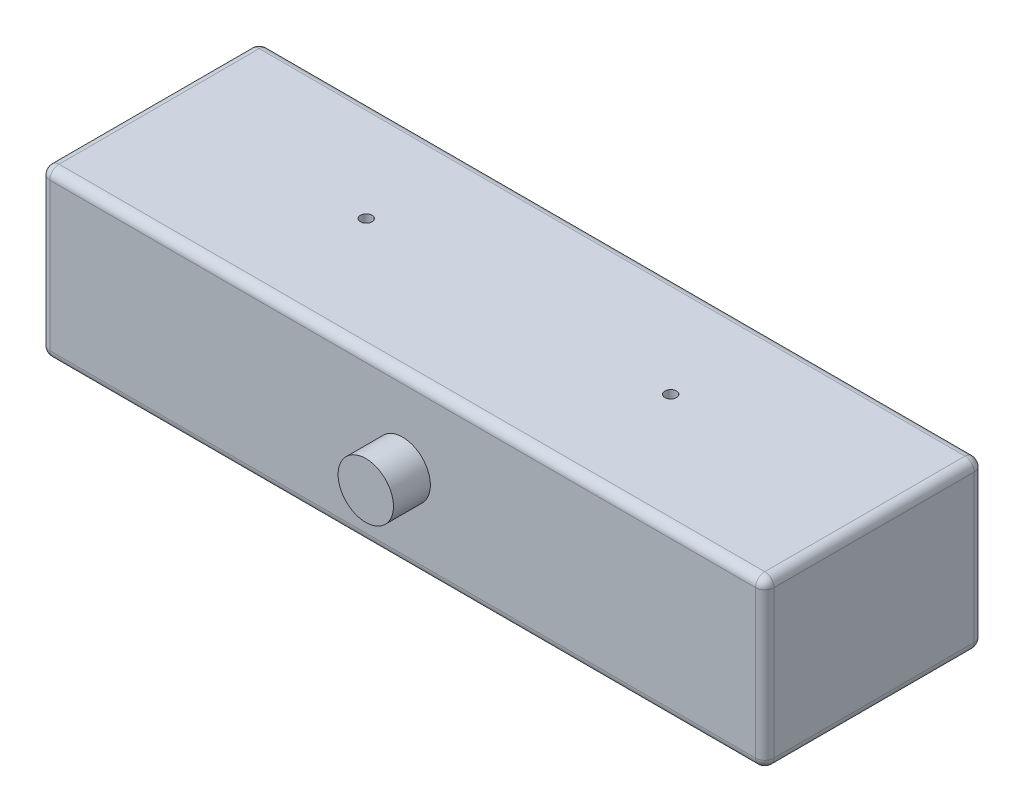
ISO-10303-21;
HEADER;
FILE_DESCRIPTION(('STEP AP214'),'2;1');
FILE_NAME('part.step','',(''),(''),'','','');
FILE_SCHEMA(('AUTOMOTIVE_DESIGN { 1 0 10303 214 1 1 1 1 }'));
ENDSEC;
DATA;
#1=APPLICATION_CONTEXT('core data for automotive mechanical design processes');
#2=APPLICATION_PROTOCOL_DEFINITION('international standard','automotive_design',2000,#1);
#3=PRODUCT_CONTEXT('',#1,'mechanical');
#4=PRODUCT('Part','Part','',(#3));
#5=PRODUCT_RELATED_PRODUCT_CATEGORY('part','',(#4));
#6=PRODUCT_DEFINITION_FORMATION('','',#4);
#7=PRODUCT_DEFINITION_CONTEXT('part definition',#1,'design');
#8=PRODUCT_DEFINITION('design','',#6,#7);
#9=PRODUCT_DEFINITION_SHAPE('','',#8);
#10=(LENGTH_UNIT() NAMED_UNIT(*) SI_UNIT(.MILLI.,.METRE.));
#11=(NAMED_UNIT(*) PLANE_ANGLE_UNIT() SI_UNIT($,.RADIAN.));
#12=(NAMED_UNIT(*) SI_UNIT($,.STERADIAN.) SOLID_ANGLE_UNIT());
#13=UNCERTAINTY_MEASURE_WITH_UNIT(LENGTH_MEASURE(1.E-05),#10,'distance_accuracy_value','');
#14=(GEOMETRIC_REPRESENTATION_CONTEXT(3) GLOBAL_UNCERTAINTY_ASSIGNED_CONTEXT((#13)) GLOBAL_UNIT_ASSIGNED_CONTEXT((#10,
#11,#12)) REPRESENTATION_CONTEXT('',''));
#15=CARTESIAN_POINT('',(0.,0.,0.));
#16=DIRECTION('',(0.,0.,1.));
#17=DIRECTION('',(1.,0.,0.));
#18=AXIS2_PLACEMENT_3D('',#15,#16,#17);
#19=CARTESIAN_POINT('',(78.5,-18.,23.7));
#20=DIRECTION('',(0.,0.,-1.));
#21=DIRECTION('',(-1.,0.,0.));
#22=AXIS2_PLACEMENT_3D('',#19,#20,#21);
#23=PLANE('',#22);
#24=DIRECTION('',(0.,-1.,0.));
#25=VECTOR('',#24,1.);
#26=CARTESIAN_POINT('',(-76.5,-18.,23.7));
#27=LINE('',#26,#25);
#28=CARTESIAN_POINT('',(-76.5,16.,23.7));
#29=VERTEX_POINT('',#28);
#30=CARTESIAN_POINT('',(-76.5,-16.,23.7));
#31=VERTEX_POINT('',#30);
#32=EDGE_CURVE('E158',#29,#31,#27,.T.);
#33=ORIENTED_EDGE('',*,*,#32,.T.);
#34=DIRECTION('',(-1.,0.,0.));
#35=VECTOR('',#34,1.);
#36=CARTESIAN_POINT('',(78.5,-16.,23.7));
#37=LINE('',#36,#35);
#38=CARTESIAN_POINT('',(76.5,-16.,23.7));
#39=VERTEX_POINT('',#38);
#40=EDGE_CURVE('E161',#31,#39,#37,.F.);
#41=ORIENTED_EDGE('',*,*,#40,.T.);
#42=DIRECTION('',(0.,-1.,0.));
#43=VECTOR('',#42,1.);
#44=CARTESIAN_POINT('',(76.5,-18.,23.7));
#45=LINE('',#44,#43);
#46=CARTESIAN_POINT('',(76.5,16.,23.7));
#47=VERTEX_POINT('',#46);
#48=EDGE_CURVE('E155',#39,#47,#45,.F.);
#49=ORIENTED_EDGE('',*,*,#48,.T.);
#50=DIRECTION('',(-1.,0.,0.));
#51=VECTOR('',#50,1.);
#52=CARTESIAN_POINT('',(78.5,16.,23.7));
#53=LINE('',#52,#51);
#54=EDGE_CURVE('E153',#47,#29,#53,.T.);
#55=ORIENTED_EDGE('',*,*,#54,.T.);
#56=EDGE_LOOP('',(#33,#41,#49,#55));
#57=FACE_BOUND('',#56,.T.);
#58=CARTESIAN_POINT('',(0.,0.,23.7));
#59=DIRECTION('',(0.,0.,-1.));
#60=DIRECTION('',(-1.,0.,0.));
#61=AXIS2_PLACEMENT_3D('',#58,#59,#60);
#62=CIRCLE('',#61,6.);
#63=CARTESIAN_POINT('',(-6.,0.,23.7));
#64=VERTEX_POINT('',#63);
#65=EDGE_CURVE('E11',#64,#64,#62,.F.);
#66=ORIENTED_EDGE('',*,*,#65,.F.);
#67=EDGE_LOOP('',(#66));
#68=FACE_BOUND('',#67,.T.);
#69=ADVANCED_FACE('F37',(#57,#68),#23,.F.);
#70=CARTESIAN_POINT('',(78.5,-18.,-23.7));
#71=DIRECTION('',(0.,0.,1.));
#72=DIRECTION('',(1.,0.,0.));
#73=AXIS2_PLACEMENT_3D('',#70,#71,#72);
#74=PLANE('',#73);
#75=CARTESIAN_POINT('',(60.,0.,-23.7));
#76=DIRECTION('',(0.,0.,-1.));
#77=DIRECTION('',(-1.,0.,0.));
#78=AXIS2_PLACEMENT_3D('',#75,#76,#77);
#79=CIRCLE('',#78,9.);
#80=CARTESIAN_POINT('',(51.,0.,-23.7));
#81=VERTEX_POINT('',#80);
#82=EDGE_CURVE('E445',#81,#81,#79,.T.);
#83=ORIENTED_EDGE('',*,*,#82,.F.);
#84=EDGE_LOOP('',(#83));
#85=FACE_BOUND('',#84,.T.);
#86=CARTESIAN_POINT('',(-60.,0.,-23.7));
#87=DIRECTION('',(0.,0.,-1.));
#88=DIRECTION('',(-1.,0.,0.));
#89=AXIS2_PLACEMENT_3D('',#86,#87,#88);
#90=CIRCLE('',#89,8.99999999999989);
#91=CARTESIAN_POINT('',(-68.9999999999999,0.,-23.7));
#92=VERTEX_POINT('',#91);
#93=EDGE_CURVE('E452',#92,#92,#90,.T.);
#94=ORIENTED_EDGE('',*,*,#93,.F.);
#95=EDGE_LOOP('',(#94));
#96=FACE_BOUND('',#95,.T.);
#97=DIRECTION('',(0.,1.,0.));
#98=VECTOR('',#97,1.);
#99=CARTESIAN_POINT('',(76.5,-18.,-23.7));
#100=LINE('',#99,#98);
#101=CARTESIAN_POINT('',(76.5,16.,-23.7));
#102=VERTEX_POINT('',#101);
#103=CARTESIAN_POINT('',(76.5,-16.,-23.7));
#104=VERTEX_POINT('',#103);
#105=EDGE_CURVE('E174',#102,#104,#100,.F.);
#106=ORIENTED_EDGE('',*,*,#105,.T.);
#107=DIRECTION('',(-1.,0.,0.));
#108=VECTOR('',#107,1.);
#109=CARTESIAN_POINT('',(78.5,-16.,-23.7));
#110=LINE('',#109,#108);
#111=CARTESIAN_POINT('',(-76.5,-16.,-23.7));
#112=VERTEX_POINT('',#111);
#113=EDGE_CURVE('E179',#104,#112,#110,.T.);
#114=ORIENTED_EDGE('',*,*,#113,.T.);
#115=DIRECTION('',(0.,1.,0.));
#116=VECTOR('',#115,1.);
#117=CARTESIAN_POINT('',(-76.5,18.,-23.7));
#118=LINE('',#117,#116);
#119=CARTESIAN_POINT('',(-76.5,16.,-23.7));
#120=VERTEX_POINT('',#119);
#121=EDGE_CURVE('E176',#112,#120,#118,.T.);
#122=ORIENTED_EDGE('',*,*,#121,.T.);
#123=DIRECTION('',(-1.,0.,0.));
#124=VECTOR('',#123,1.);
#125=CARTESIAN_POINT('',(78.5,16.,-23.7));
#126=LINE('',#125,#124);
#127=EDGE_CURVE('E172',#120,#102,#126,.F.);
#128=ORIENTED_EDGE('',*,*,#127,.T.);
#129=EDGE_LOOP('',(#106,#114,#122,#128));
#130=FACE_BOUND('',#129,.T.);
#131=ADVANCED_FACE('F337',(#85,#96,#130),#74,.F.);
#132=CARTESIAN_POINT('',(78.5,18.,23.7));
#133=DIRECTION('',(0.,-1.,0.));
#134=DIRECTION('',(0.,0.,-1.));
#135=AXIS2_PLACEMENT_3D('',#132,#133,#134);
#136=PLANE('',#135);
#137=CARTESIAN_POINT('',(-33.,18.,-1.39999999999999));
#138=DIRECTION('',(0.,1.,0.));
#139=DIRECTION('',(0.,0.,1.));
#140=AXIS2_PLACEMENT_3D('',#137,#138,#139);
#141=CIRCLE('',#140,1.24999999999999);
#142=CARTESIAN_POINT('',(-33.,18.,-0.150000000000004));
#143=VERTEX_POINT('',#142);
#144=EDGE_CURVE('E140',#143,#143,#141,.T.);
#145=ORIENTED_EDGE('',*,*,#144,.F.);
#146=EDGE_LOOP('',(#145));
#147=FACE_BOUND('',#146,.T.);
#148=CARTESIAN_POINT('',(33.,18.,-1.39999999999999));
#149=DIRECTION('',(0.,1.,0.));
#150=DIRECTION('',(0.,0.,1.));
#151=AXIS2_PLACEMENT_3D('',#148,#149,#150);
#152=CIRCLE('',#151,1.24999999999999);
#153=CARTESIAN_POINT('',(33.,18.,-0.150000000000004));
#154=VERTEX_POINT('',#153);
#155=EDGE_CURVE('E139',#154,#154,#152,.T.);
#156=ORIENTED_EDGE('',*,*,#155,.F.);
#157=EDGE_LOOP('',(#156));
#158=FACE_BOUND('',#157,.T.);
#159=DIRECTION('',(0.,0.,1.));
#160=VECTOR('',#159,1.);
#161=CARTESIAN_POINT('',(76.5,18.,23.7));
#162=LINE('',#161,#160);
#163=CARTESIAN_POINT('',(76.5,18.,21.7));
#164=VERTEX_POINT('',#163);
#165=CARTESIAN_POINT('',(76.5,18.,-21.7));
#166=VERTEX_POINT('',#165);
#167=EDGE_CURVE('E52',#164,#166,#162,.F.);
#168=ORIENTED_EDGE('',*,*,#167,.T.);
#169=DIRECTION('',(-1.,0.,0.));
#170=VECTOR('',#169,1.);
#171=CARTESIAN_POINT('',(78.5,18.,-21.7));
#172=LINE('',#171,#170);
#173=CARTESIAN_POINT('',(-76.5,18.,-21.7));
#174=VERTEX_POINT('',#173);
#175=EDGE_CURVE('E45',#166,#174,#172,.T.);
#176=ORIENTED_EDGE('',*,*,#175,.T.);
#177=DIRECTION('',(0.,0.,1.));
#178=VECTOR('',#177,1.);
#179=CARTESIAN_POINT('',(-76.5,18.,23.7));
#180=LINE('',#179,#178);
#181=CARTESIAN_POINT('',(-76.5,18.,21.7));
#182=VERTEX_POINT('',#181);
#183=EDGE_CURVE('E199',#174,#182,#180,.T.);
#184=ORIENTED_EDGE('',*,*,#183,.T.);
#185=DIRECTION('',(-1.,0.,0.));
#186=VECTOR('',#185,1.);
#187=CARTESIAN_POINT('',(78.5,18.,21.7));
#188=LINE('',#187,#186);
#189=EDGE_CURVE('E57',#182,#164,#188,.F.);
#190=ORIENTED_EDGE('',*,*,#189,.T.);
#191=EDGE_LOOP('',(#168,#176,#184,#190));
#192=FACE_BOUND('',#191,.T.);
#193=ADVANCED_FACE('F280',(#147,#158,#192),#136,.F.);
#194=CARTESIAN_POINT('',(78.5,-18.,23.7));
#195=DIRECTION('',(0.,1.,0.));
#196=DIRECTION('',(0.,0.,1.));
#197=AXIS2_PLACEMENT_3D('',#194,#195,#196);
#198=PLANE('',#197);
#199=DIRECTION('',(0.,0.,-1.));
#200=VECTOR('',#199,1.);
#201=CARTESIAN_POINT('',(76.5,-18.,23.7));
#202=LINE('',#201,#200);
#203=CARTESIAN_POINT('',(76.5,-18.,-21.7));
#204=VERTEX_POINT('',#203);
#205=CARTESIAN_POINT('',(76.5,-18.,21.7));
#206=VERTEX_POINT('',#205);
#207=EDGE_CURVE('E194',#204,#206,#202,.F.);
#208=ORIENTED_EDGE('',*,*,#207,.T.);
#209=DIRECTION('',(-1.,0.,0.));
#210=VECTOR('',#209,1.);
#211=CARTESIAN_POINT('',(78.5,-18.,21.7));
#212=LINE('',#211,#210);
#213=CARTESIAN_POINT('',(-76.5,-18.,21.7));
#214=VERTEX_POINT('',#213);
#215=EDGE_CURVE('E196',#206,#214,#212,.T.);
#216=ORIENTED_EDGE('',*,*,#215,.T.);
#217=DIRECTION('',(0.,0.,-1.));
#218=VECTOR('',#217,1.);
#219=CARTESIAN_POINT('',(-76.5,-18.,-23.7));
#220=LINE('',#219,#218);
#221=CARTESIAN_POINT('',(-76.5,-18.,-21.7));
#222=VERTEX_POINT('',#221);
#223=EDGE_CURVE('E190',#214,#222,#220,.T.);
#224=ORIENTED_EDGE('',*,*,#223,.T.);
#225=DIRECTION('',(-1.,0.,0.));
#226=VECTOR('',#225,1.);
#227=CARTESIAN_POINT('',(78.5,-18.,-21.7));
#228=LINE('',#227,#226);
#229=EDGE_CURVE('E192',#222,#204,#228,.F.);
#230=ORIENTED_EDGE('',*,*,#229,.T.);
#231=EDGE_LOOP('',(#208,#216,#224,#230));
#232=FACE_BOUND('',#231,.T.);
#233=ADVANCED_FACE('F328',(#232),#198,.F.);
#234=CARTESIAN_POINT('',(78.5,0.,0.));
#235=DIRECTION('',(-1.,0.,0.));
#236=DIRECTION('',(0.,0.,1.));
#237=AXIS2_PLACEMENT_3D('',#234,#235,#236);
#238=PLANE('',#237);
#239=DIRECTION('',(0.,-1.,0.));
#240=VECTOR('',#239,1.);
#241=CARTESIAN_POINT('',(78.5,0.,21.7));
#242=LINE('',#241,#240);
#243=CARTESIAN_POINT('',(78.5,16.,21.7));
#244=VERTEX_POINT('',#243);
#245=CARTESIAN_POINT('',(78.5,-16.,21.7));
#246=VERTEX_POINT('',#245);
#247=EDGE_CURVE('E185',#244,#246,#242,.T.);
#248=ORIENTED_EDGE('',*,*,#247,.T.);
#249=DIRECTION('',(0.,0.,-1.));
#250=VECTOR('',#249,1.);
#251=CARTESIAN_POINT('',(78.5,-16.,0.));
#252=LINE('',#251,#250);
#253=CARTESIAN_POINT('',(78.5,-16.,-21.7));
#254=VERTEX_POINT('',#253);
#255=EDGE_CURVE('E188',#246,#254,#252,.T.);
#256=ORIENTED_EDGE('',*,*,#255,.T.);
#257=DIRECTION('',(0.,1.,0.));
#258=VECTOR('',#257,1.);
#259=CARTESIAN_POINT('',(78.5,0.,-21.7));
#260=LINE('',#259,#258);
#261=CARTESIAN_POINT('',(78.5,16.,-21.7));
#262=VERTEX_POINT('',#261);
#263=EDGE_CURVE('E183',#254,#262,#260,.T.);
#264=ORIENTED_EDGE('',*,*,#263,.T.);
#265=DIRECTION('',(0.,0.,1.));
#266=VECTOR('',#265,1.);
#267=CARTESIAN_POINT('',(78.5,16.,0.));
#268=LINE('',#267,#266);
#269=EDGE_CURVE('E181',#262,#244,#268,.T.);
#270=ORIENTED_EDGE('',*,*,#269,.T.);
#271=EDGE_LOOP('',(#248,#256,#264,#270));
#272=FACE_BOUND('',#271,.T.);
#273=ADVANCED_FACE('F314',(#272),#238,.F.);
#274=CARTESIAN_POINT('',(-78.5,0.,0.));
#275=DIRECTION('',(-1.,0.,0.));
#276=DIRECTION('',(0.,0.,1.));
#277=AXIS2_PLACEMENT_3D('',#274,#275,#276);
#278=PLANE('',#277);
#279=DIRECTION('',(0.,1.,0.));
#280=VECTOR('',#279,1.);
#281=CARTESIAN_POINT('',(-78.5,-18.,-21.7));
#282=LINE('',#281,#280);
#283=CARTESIAN_POINT('',(-78.5,16.,-21.7));
#284=VERTEX_POINT('',#283);
#285=CARTESIAN_POINT('',(-78.5,-16.,-21.7));
#286=VERTEX_POINT('',#285);
#287=EDGE_CURVE('E165',#284,#286,#282,.F.);
#288=ORIENTED_EDGE('',*,*,#287,.T.);
#289=DIRECTION('',(0.,0.,-1.));
#290=VECTOR('',#289,1.);
#291=CARTESIAN_POINT('',(-78.5,-16.,23.7));
#292=LINE('',#291,#290);
#293=CARTESIAN_POINT('',(-78.5,-16.,21.7));
#294=VERTEX_POINT('',#293);
#295=EDGE_CURVE('E170',#286,#294,#292,.F.);
#296=ORIENTED_EDGE('',*,*,#295,.T.);
#297=DIRECTION('',(0.,-1.,0.));
#298=VECTOR('',#297,1.);
#299=CARTESIAN_POINT('',(-78.5,18.,21.7));
#300=LINE('',#299,#298);
#301=CARTESIAN_POINT('',(-78.5,16.,21.7));
#302=VERTEX_POINT('',#301);
#303=EDGE_CURVE('E167',#294,#302,#300,.F.);
#304=ORIENTED_EDGE('',*,*,#303,.T.);
#305=DIRECTION('',(0.,0.,1.));
#306=VECTOR('',#305,1.);
#307=CARTESIAN_POINT('',(-78.5,16.,-23.7));
#308=LINE('',#307,#306);
#309=EDGE_CURVE('E163',#302,#284,#308,.F.);
#310=ORIENTED_EDGE('',*,*,#309,.T.);
#311=EDGE_LOOP('',(#288,#296,#304,#310));
#312=FACE_BOUND('',#311,.T.);
#313=ADVANCED_FACE('F401',(#312),#278,.T.);
#314=CARTESIAN_POINT('',(76.5,0.,-21.7));
#315=DIRECTION('',(0.,1.,0.));
#316=DIRECTION('',(0.,0.,1.));
#317=AXIS2_PLACEMENT_3D('',#314,#315,#316);
#318=CYLINDRICAL_SURFACE('',#317,2.);
#319=CARTESIAN_POINT('',(76.5,16.,-21.7));
#320=DIRECTION('',(0.,1.,0.));
#321=DIRECTION('',(0.,0.,1.));
#322=AXIS2_PLACEMENT_3D('',#319,#320,#321);
#323=CIRCLE('',#322,2.);
#324=EDGE_CURVE('E156',#262,#102,#323,.T.);
#325=ORIENTED_EDGE('',*,*,#324,.F.);
#326=ORIENTED_EDGE('',*,*,#263,.F.);
#327=CARTESIAN_POINT('',(76.5,-16.,-21.7));
#328=DIRECTION('',(0.,-1.,0.));
#329=DIRECTION('',(0.,0.,-1.));
#330=AXIS2_PLACEMENT_3D('',#327,#328,#329);
#331=CIRCLE('',#330,2.);
#332=EDGE_CURVE('E263',#104,#254,#331,.T.);
#333=ORIENTED_EDGE('',*,*,#332,.F.);
#334=ORIENTED_EDGE('',*,*,#105,.F.);
#335=EDGE_LOOP('',(#325,#326,#333,#334));
#336=FACE_BOUND('',#335,.T.);
#337=ADVANCED_FACE('F39',(#336),#318,.T.);
#338=CARTESIAN_POINT('',(76.5,16.,-21.7));
#339=DIRECTION('',(0.,0.,1.));
#340=DIRECTION('',(1.,0.,0.));
#341=AXIS2_PLACEMENT_3D('',#338,#339,#340);
#342=SPHERICAL_SURFACE('',#341,2.);
#343=CARTESIAN_POINT('',(76.5,16.,-21.7));
#344=DIRECTION('',(0.,0.,-1.));
#345=DIRECTION('',(-1.,0.,0.));
#346=AXIS2_PLACEMENT_3D('',#343,#344,#345);
#347=CIRCLE('',#346,2.);
#348=EDGE_CURVE('E258',#262,#166,#347,.F.);
#349=ORIENTED_EDGE('',*,*,#348,.F.);
#350=ORIENTED_EDGE('',*,*,#324,.T.);
#351=CARTESIAN_POINT('',(76.5,16.,-21.7));
#352=DIRECTION('',(1.,0.,0.));
#353=DIRECTION('',(0.,0.,-1.));
#354=AXIS2_PLACEMENT_3D('',#351,#352,#353);
#355=CIRCLE('',#354,2.);
#356=EDGE_CURVE('E260',#166,#102,#355,.F.);
#357=ORIENTED_EDGE('',*,*,#356,.F.);
#358=EDGE_LOOP('',(#349,#350,#357));
#359=FACE_BOUND('',#358,.T.);
#360=ADVANCED_FACE('F270',(#359),#342,.T.);
#361=CARTESIAN_POINT('',(76.5,-16.,-21.7));
#362=DIRECTION('',(0.,0.,1.));
#363=DIRECTION('',(1.,0.,0.));
#364=AXIS2_PLACEMENT_3D('',#361,#362,#363);
#365=SPHERICAL_SURFACE('',#364,2.);
#366=CARTESIAN_POINT('',(76.5,-16.,-21.7));
#367=DIRECTION('',(1.,0.,0.));
#368=DIRECTION('',(0.,0.,-1.));
#369=AXIS2_PLACEMENT_3D('',#366,#367,#368);
#370=CIRCLE('',#369,2.);
#371=EDGE_CURVE('E252',#104,#204,#370,.F.);
#372=ORIENTED_EDGE('',*,*,#371,.F.);
#373=ORIENTED_EDGE('',*,*,#332,.T.);
#374=CARTESIAN_POINT('',(76.5,-16.,-21.7));
#375=DIRECTION('',(0.,0.,-1.));
#376=DIRECTION('',(-1.,0.,0.));
#377=AXIS2_PLACEMENT_3D('',#374,#375,#376);
#378=CIRCLE('',#377,2.);
#379=EDGE_CURVE('E255',#204,#254,#378,.F.);
#380=ORIENTED_EDGE('',*,*,#379,.F.);
#381=EDGE_LOOP('',(#372,#373,#380));
#382=FACE_BOUND('',#381,.T.);
#383=ADVANCED_FACE('F320',(#382),#365,.T.);
#384=CARTESIAN_POINT('',(78.5,16.,-21.7));
#385=DIRECTION('',(-1.,0.,0.));
#386=DIRECTION('',(0.,0.,1.));
#387=AXIS2_PLACEMENT_3D('',#384,#385,#386);
#388=CYLINDRICAL_SURFACE('',#387,2.);
#389=ORIENTED_EDGE('',*,*,#356,.T.);
#390=ORIENTED_EDGE('',*,*,#127,.F.);
#391=CARTESIAN_POINT('',(-76.5,16.,-21.7));
#392=DIRECTION('',(-1.,0.,0.));
#393=DIRECTION('',(0.,0.,1.));
#394=AXIS2_PLACEMENT_3D('',#391,#392,#393);
#395=CIRCLE('',#394,2.);
#396=EDGE_CURVE('E247',#174,#120,#395,.T.);
#397=ORIENTED_EDGE('',*,*,#396,.F.);
#398=ORIENTED_EDGE('',*,*,#175,.F.);
#399=EDGE_LOOP('',(#389,#390,#397,#398));
#400=FACE_BOUND('',#399,.T.);
#401=ADVANCED_FACE('F278',(#400),#388,.T.);
#402=CARTESIAN_POINT('',(76.5,16.,0.));
#403=DIRECTION('',(0.,0.,1.));
#404=DIRECTION('',(1.,0.,0.));
#405=AXIS2_PLACEMENT_3D('',#402,#403,#404);
#406=CYLINDRICAL_SURFACE('',#405,2.);
#407=ORIENTED_EDGE('',*,*,#348,.T.);
#408=ORIENTED_EDGE('',*,*,#167,.F.);
#409=CARTESIAN_POINT('',(76.5,16.,21.7));
#410=DIRECTION('',(0.,0.,1.));
#411=DIRECTION('',(1.,0.,0.));
#412=AXIS2_PLACEMENT_3D('',#409,#410,#411);
#413=CIRCLE('',#412,2.);
#414=EDGE_CURVE('E244',#244,#164,#413,.T.);
#415=ORIENTED_EDGE('',*,*,#414,.F.);
#416=ORIENTED_EDGE('',*,*,#269,.F.);
#417=EDGE_LOOP('',(#407,#408,#415,#416));
#418=FACE_BOUND('',#417,.T.);
#419=ADVANCED_FACE('F312',(#418),#406,.T.);
#420=CARTESIAN_POINT('',(76.5,0.,21.7));
#421=DIRECTION('',(0.,-1.,0.));
#422=DIRECTION('',(0.,0.,-1.));
#423=AXIS2_PLACEMENT_3D('',#420,#421,#422);
#424=CYLINDRICAL_SURFACE('',#423,2.);
#425=CARTESIAN_POINT('',(76.5,-16.,21.7));
#426=DIRECTION('',(0.,-1.,0.));
#427=DIRECTION('',(0.,0.,-1.));
#428=AXIS2_PLACEMENT_3D('',#425,#426,#427);
#429=CIRCLE('',#428,2.);
#430=EDGE_CURVE('E238',#246,#39,#429,.T.);
#431=ORIENTED_EDGE('',*,*,#430,.F.);
#432=ORIENTED_EDGE('',*,*,#247,.F.);
#433=CARTESIAN_POINT('',(76.5,16.,21.7));
#434=DIRECTION('',(0.,1.,0.));
#435=DIRECTION('',(0.,0.,1.));
#436=AXIS2_PLACEMENT_3D('',#433,#434,#435);
#437=CIRCLE('',#436,2.);
#438=EDGE_CURVE('E241',#47,#244,#437,.T.);
#439=ORIENTED_EDGE('',*,*,#438,.F.);
#440=ORIENTED_EDGE('',*,*,#48,.F.);
#441=EDGE_LOOP('',(#431,#432,#439,#440));
#442=FACE_BOUND('',#441,.T.);
#443=ADVANCED_FACE('F307',(#442),#424,.T.);
#444=CARTESIAN_POINT('',(76.5,-16.,0.));
#445=DIRECTION('',(0.,0.,-1.));
#446=DIRECTION('',(-1.,0.,0.));
#447=AXIS2_PLACEMENT_3D('',#444,#445,#446);
#448=CYLINDRICAL_SURFACE('',#447,2.);
#449=ORIENTED_EDGE('',*,*,#379,.T.);
#450=ORIENTED_EDGE('',*,*,#255,.F.);
#451=CARTESIAN_POINT('',(76.5,-16.,21.7));
#452=DIRECTION('',(0.,0.,1.));
#453=DIRECTION('',(1.,0.,0.));
#454=AXIS2_PLACEMENT_3D('',#451,#452,#453);
#455=CIRCLE('',#454,2.);
#456=EDGE_CURVE('E236',#206,#246,#455,.T.);
#457=ORIENTED_EDGE('',*,*,#456,.F.);
#458=ORIENTED_EDGE('',*,*,#207,.F.);
#459=EDGE_LOOP('',(#449,#450,#457,#458));
#460=FACE_BOUND('',#459,.T.);
#461=ADVANCED_FACE('F324',(#460),#448,.T.);
#462=CARTESIAN_POINT('',(78.5,-16.,-21.7));
#463=DIRECTION('',(-1.,0.,0.));
#464=DIRECTION('',(0.,0.,1.));
#465=AXIS2_PLACEMENT_3D('',#462,#463,#464);
#466=CYLINDRICAL_SURFACE('',#465,2.);
#467=ORIENTED_EDGE('',*,*,#371,.T.);
#468=ORIENTED_EDGE('',*,*,#229,.F.);
#469=CARTESIAN_POINT('',(-76.5,-16.,-21.7));
#470=DIRECTION('',(-1.,0.,0.));
#471=DIRECTION('',(0.,0.,1.));
#472=AXIS2_PLACEMENT_3D('',#469,#470,#471);
#473=CIRCLE('',#472,2.);
#474=EDGE_CURVE('E233',#112,#222,#473,.T.);
#475=ORIENTED_EDGE('',*,*,#474,.F.);
#476=ORIENTED_EDGE('',*,*,#113,.F.);
#477=EDGE_LOOP('',(#467,#468,#475,#476));
#478=FACE_BOUND('',#477,.T.);
#479=ADVANCED_FACE('F334',(#478),#466,.T.);
#480=CARTESIAN_POINT('',(-76.5,-18.,-21.7));
#481=DIRECTION('',(0.,-1.,0.));
#482=DIRECTION('',(0.,0.,-1.));
#483=AXIS2_PLACEMENT_3D('',#480,#481,#482);
#484=CYLINDRICAL_SURFACE('',#483,2.);
#485=CARTESIAN_POINT('',(-76.5,16.,-21.7));
#486=DIRECTION('',(0.,1.,0.));
#487=DIRECTION('',(0.,0.,1.));
#488=AXIS2_PLACEMENT_3D('',#485,#486,#487);
#489=CIRCLE('',#488,2.);
#490=EDGE_CURVE('E249',#120,#284,#489,.T.);
#491=ORIENTED_EDGE('',*,*,#490,.F.);
#492=ORIENTED_EDGE('',*,*,#121,.F.);
#493=CARTESIAN_POINT('',(-76.5,-16.,-21.7));
#494=DIRECTION('',(0.,-1.,0.));
#495=DIRECTION('',(0.,0.,-1.));
#496=AXIS2_PLACEMENT_3D('',#493,#494,#495);
#497=CIRCLE('',#496,2.);
#498=EDGE_CURVE('E230',#286,#112,#497,.T.);
#499=ORIENTED_EDGE('',*,*,#498,.F.);
#500=ORIENTED_EDGE('',*,*,#287,.F.);
#501=EDGE_LOOP('',(#491,#492,#499,#500));
#502=FACE_BOUND('',#501,.T.);
#503=ADVANCED_FACE('F341',(#502),#484,.T.);
#504=CARTESIAN_POINT('',(-76.5,16.,-21.7));
#505=DIRECTION('',(0.,0.,1.));
#506=DIRECTION('',(1.,0.,0.));
#507=AXIS2_PLACEMENT_3D('',#504,#505,#506);
#508=SPHERICAL_SURFACE('',#507,2.);
#509=ORIENTED_EDGE('',*,*,#396,.T.);
#510=ORIENTED_EDGE('',*,*,#490,.T.);
#511=CARTESIAN_POINT('',(-76.5,16.,-21.7));
#512=DIRECTION('',(0.,0.,-1.));
#513=DIRECTION('',(-1.,0.,0.));
#514=AXIS2_PLACEMENT_3D('',#511,#512,#513);
#515=CIRCLE('',#514,2.);
#516=EDGE_CURVE('E227',#174,#284,#515,.F.);
#517=ORIENTED_EDGE('',*,*,#516,.F.);
#518=EDGE_LOOP('',(#509,#510,#517));
#519=FACE_BOUND('',#518,.T.);
#520=ADVANCED_FACE('F345',(#519),#508,.T.);
#521=CARTESIAN_POINT('',(76.5,16.,21.7));
#522=DIRECTION('',(0.,0.,1.));
#523=DIRECTION('',(1.,0.,0.));
#524=AXIS2_PLACEMENT_3D('',#521,#522,#523);
#525=SPHERICAL_SURFACE('',#524,2.);
#526=ORIENTED_EDGE('',*,*,#438,.T.);
#527=ORIENTED_EDGE('',*,*,#414,.T.);
#528=CARTESIAN_POINT('',(76.5,16.,21.7));
#529=DIRECTION('',(1.,0.,0.));
#530=DIRECTION('',(0.,0.,-1.));
#531=AXIS2_PLACEMENT_3D('',#528,#529,#530);
#532=CIRCLE('',#531,2.);
#533=EDGE_CURVE('E224',#47,#164,#532,.F.);
#534=ORIENTED_EDGE('',*,*,#533,.F.);
#535=EDGE_LOOP('',(#526,#527,#534));
#536=FACE_BOUND('',#535,.T.);
#537=ADVANCED_FACE('F310',(#536),#525,.T.);
#538=CARTESIAN_POINT('',(76.5,-16.,21.7));
#539=DIRECTION('',(0.,0.,1.));
#540=DIRECTION('',(1.,0.,0.));
#541=AXIS2_PLACEMENT_3D('',#538,#539,#540);
#542=SPHERICAL_SURFACE('',#541,2.);
#543=ORIENTED_EDGE('',*,*,#456,.T.);
#544=ORIENTED_EDGE('',*,*,#430,.T.);
#545=CARTESIAN_POINT('',(76.5,-16.,21.7));
#546=DIRECTION('',(1.,0.,0.));
#547=DIRECTION('',(0.,0.,-1.));
#548=AXIS2_PLACEMENT_3D('',#545,#546,#547);
#549=CIRCLE('',#548,2.);
#550=EDGE_CURVE('E221',#206,#39,#549,.F.);
#551=ORIENTED_EDGE('',*,*,#550,.F.);
#552=EDGE_LOOP('',(#543,#544,#551));
#553=FACE_BOUND('',#552,.T.);
#554=ADVANCED_FACE('F352',(#553),#542,.T.);
#555=CARTESIAN_POINT('',(-76.5,-16.,-21.7));
#556=DIRECTION('',(0.,0.,1.));
#557=DIRECTION('',(1.,0.,0.));
#558=AXIS2_PLACEMENT_3D('',#555,#556,#557);
#559=SPHERICAL_SURFACE('',#558,2.);
#560=ORIENTED_EDGE('',*,*,#498,.T.);
#561=ORIENTED_EDGE('',*,*,#474,.T.);
#562=CARTESIAN_POINT('',(-76.5,-16.,-21.7));
#563=DIRECTION('',(0.,0.,-1.));
#564=DIRECTION('',(-1.,0.,0.));
#565=AXIS2_PLACEMENT_3D('',#562,#563,#564);
#566=CIRCLE('',#565,2.);
#567=EDGE_CURVE('E218',#286,#222,#566,.F.);
#568=ORIENTED_EDGE('',*,*,#567,.F.);
#569=EDGE_LOOP('',(#560,#561,#568));
#570=FACE_BOUND('',#569,.T.);
#571=ADVANCED_FACE('F389',(#570),#559,.T.);
#572=CARTESIAN_POINT('',(-76.5,16.,23.7));
#573=DIRECTION('',(0.,0.,-1.));
#574=DIRECTION('',(-1.,0.,0.));
#575=AXIS2_PLACEMENT_3D('',#572,#573,#574);
#576=CYLINDRICAL_SURFACE('',#575,2.);
#577=ORIENTED_EDGE('',*,*,#516,.T.);
#578=ORIENTED_EDGE('',*,*,#309,.F.);
#579=CARTESIAN_POINT('',(-76.5,16.,21.7));
#580=DIRECTION('',(0.,0.,1.));
#581=DIRECTION('',(1.,0.,0.));
#582=AXIS2_PLACEMENT_3D('',#579,#580,#581);
#583=CIRCLE('',#582,2.);
#584=EDGE_CURVE('E215',#182,#302,#583,.T.);
#585=ORIENTED_EDGE('',*,*,#584,.F.);
#586=ORIENTED_EDGE('',*,*,#183,.F.);
#587=EDGE_LOOP('',(#577,#578,#585,#586));
#588=FACE_BOUND('',#587,.T.);
#589=ADVANCED_FACE('F291',(#588),#576,.T.);
#590=CARTESIAN_POINT('',(78.5,16.,21.7));
#591=DIRECTION('',(-1.,0.,0.));
#592=DIRECTION('',(0.,0.,1.));
#593=AXIS2_PLACEMENT_3D('',#590,#591,#592);
#594=CYLINDRICAL_SURFACE('',#593,2.);
#595=ORIENTED_EDGE('',*,*,#533,.T.);
#596=ORIENTED_EDGE('',*,*,#189,.F.);
#597=CARTESIAN_POINT('',(-76.5,16.,21.7));
#598=DIRECTION('',(-1.,0.,0.));
#599=DIRECTION('',(0.,0.,1.));
#600=AXIS2_PLACEMENT_3D('',#597,#598,#599);
#601=CIRCLE('',#600,2.);
#602=EDGE_CURVE('E212',#29,#182,#601,.T.);
#603=ORIENTED_EDGE('',*,*,#602,.F.);
#604=ORIENTED_EDGE('',*,*,#54,.F.);
#605=EDGE_LOOP('',(#595,#596,#603,#604));
#606=FACE_BOUND('',#605,.T.);
#607=ADVANCED_FACE('F286',(#606),#594,.T.);
#608=CARTESIAN_POINT('',(78.5,-16.,21.7));
#609=DIRECTION('',(-1.,0.,0.));
#610=DIRECTION('',(0.,0.,1.));
#611=AXIS2_PLACEMENT_3D('',#608,#609,#610);
#612=CYLINDRICAL_SURFACE('',#611,2.);
#613=ORIENTED_EDGE('',*,*,#550,.T.);
#614=ORIENTED_EDGE('',*,*,#40,.F.);
#615=CARTESIAN_POINT('',(-76.5,-16.,21.7));
#616=DIRECTION('',(-1.,0.,0.));
#617=DIRECTION('',(0.,0.,1.));
#618=AXIS2_PLACEMENT_3D('',#615,#616,#617);
#619=CIRCLE('',#618,2.);
#620=EDGE_CURVE('E209',#214,#31,#619,.T.);
#621=ORIENTED_EDGE('',*,*,#620,.F.);
#622=ORIENTED_EDGE('',*,*,#215,.F.);
#623=EDGE_LOOP('',(#613,#614,#621,#622));
#624=FACE_BOUND('',#623,.T.);
#625=ADVANCED_FACE('F380',(#624),#612,.T.);
#626=CARTESIAN_POINT('',(-76.5,-16.,23.7));
#627=DIRECTION('',(0.,0.,1.));
#628=DIRECTION('',(1.,0.,0.));
#629=AXIS2_PLACEMENT_3D('',#626,#627,#628);
#630=CYLINDRICAL_SURFACE('',#629,2.);
#631=ORIENTED_EDGE('',*,*,#567,.T.);
#632=ORIENTED_EDGE('',*,*,#223,.F.);
#633=CARTESIAN_POINT('',(-76.5,-16.,21.7));
#634=DIRECTION('',(0.,0.,1.));
#635=DIRECTION('',(1.,0.,0.));
#636=AXIS2_PLACEMENT_3D('',#633,#634,#635);
#637=CIRCLE('',#636,2.);
#638=EDGE_CURVE('E207',#294,#214,#637,.T.);
#639=ORIENTED_EDGE('',*,*,#638,.F.);
#640=ORIENTED_EDGE('',*,*,#295,.F.);
#641=EDGE_LOOP('',(#631,#632,#639,#640));
#642=FACE_BOUND('',#641,.T.);
#643=ADVANCED_FACE('F377',(#642),#630,.T.);
#644=CARTESIAN_POINT('',(-76.5,16.,21.7));
#645=DIRECTION('',(0.,0.,1.));
#646=DIRECTION('',(1.,0.,0.));
#647=AXIS2_PLACEMENT_3D('',#644,#645,#646);
#648=SPHERICAL_SURFACE('',#647,2.);
#649=ORIENTED_EDGE('',*,*,#602,.T.);
#650=ORIENTED_EDGE('',*,*,#584,.T.);
#651=CARTESIAN_POINT('',(-76.5,16.,21.7));
#652=DIRECTION('',(0.,1.,0.));
#653=DIRECTION('',(0.,0.,1.));
#654=AXIS2_PLACEMENT_3D('',#651,#652,#653);
#655=CIRCLE('',#654,2.);
#656=EDGE_CURVE('E205',#29,#302,#655,.F.);
#657=ORIENTED_EDGE('',*,*,#656,.F.);
#658=EDGE_LOOP('',(#649,#650,#657));
#659=FACE_BOUND('',#658,.T.);
#660=ADVANCED_FACE('F293',(#659),#648,.T.);
#661=CARTESIAN_POINT('',(-76.5,-16.,21.7));
#662=DIRECTION('',(0.,0.,1.));
#663=DIRECTION('',(1.,0.,0.));
#664=AXIS2_PLACEMENT_3D('',#661,#662,#663);
#665=SPHERICAL_SURFACE('',#664,2.);
#666=ORIENTED_EDGE('',*,*,#638,.T.);
#667=ORIENTED_EDGE('',*,*,#620,.T.);
#668=CARTESIAN_POINT('',(-76.5,-16.,21.7));
#669=DIRECTION('',(0.,-1.,0.));
#670=DIRECTION('',(0.,0.,-1.));
#671=AXIS2_PLACEMENT_3D('',#668,#669,#670);
#672=CIRCLE('',#671,2.);
#673=EDGE_CURVE('E152',#294,#31,#672,.F.);
#674=ORIENTED_EDGE('',*,*,#673,.F.);
#675=EDGE_LOOP('',(#666,#667,#674));
#676=FACE_BOUND('',#675,.T.);
#677=ADVANCED_FACE('F371',(#676),#665,.T.);
#678=CARTESIAN_POINT('',(-76.5,-18.,21.7));
#679=DIRECTION('',(0.,1.,0.));
#680=DIRECTION('',(0.,0.,1.));
#681=AXIS2_PLACEMENT_3D('',#678,#679,#680);
#682=CYLINDRICAL_SURFACE('',#681,2.);
#683=ORIENTED_EDGE('',*,*,#656,.T.);
#684=ORIENTED_EDGE('',*,*,#303,.F.);
#685=ORIENTED_EDGE('',*,*,#673,.T.);
#686=ORIENTED_EDGE('',*,*,#32,.F.);
#687=EDGE_LOOP('',(#683,#684,#685,#686));
#688=FACE_BOUND('',#687,.T.);
#689=ADVANCED_FACE('F297',(#688),#682,.T.);
#690=CARTESIAN_POINT('',(33.,14.,-1.39999999999999));
#691=DIRECTION('',(0.,1.,0.));
#692=DIRECTION('',(0.,0.,1.));
#693=AXIS2_PLACEMENT_3D('',#690,#691,#692);
#694=CONICAL_SURFACE('',#693,1.25,1.02974425867666);
#695=CARTESIAN_POINT('',(33.,13.2489242262155,-1.39999999999999));
#696=VERTEX_POINT('',#695);
#697=VERTEX_LOOP('',#696);
#698=FACE_BOUND('',#697,.T.);
#699=CARTESIAN_POINT('',(33.,14.,-1.39999999999999));
#700=DIRECTION('',(0.,1.,0.));
#701=DIRECTION('',(0.,0.,1.));
#702=AXIS2_PLACEMENT_3D('',#699,#700,#701);
#703=CIRCLE('',#702,1.25);
#704=CARTESIAN_POINT('',(33.,14.,-0.14999999999999));
#705=VERTEX_POINT('',#704);
#706=EDGE_CURVE('E143',#705,#705,#703,.T.);
#707=ORIENTED_EDGE('',*,*,#706,.T.);
#708=EDGE_LOOP('',(#707));
#709=FACE_BOUND('',#708,.T.);
#710=ADVANCED_FACE('F370',(#698,#709),#694,.F.);
#711=CARTESIAN_POINT('',(33.,18.,-1.39999999999999));
#712=DIRECTION('',(0.,1.,0.));
#713=DIRECTION('',(0.,0.,1.));
#714=AXIS2_PLACEMENT_3D('',#711,#712,#713);
#715=CYLINDRICAL_SURFACE('',#714,1.24999999999999);
#716=ORIENTED_EDGE('',*,*,#706,.F.);
#717=EDGE_LOOP('',(#716));
#718=FACE_BOUND('',#717,.T.);
#719=ORIENTED_EDGE('',*,*,#155,.T.);
#720=EDGE_LOOP('',(#719));
#721=FACE_BOUND('',#720,.T.);
#722=ADVANCED_FACE('F133',(#718,#721),#715,.F.);
#723=CARTESIAN_POINT('',(-33.,14.,-1.39999999999999));
#724=DIRECTION('',(0.,1.,0.));
#725=DIRECTION('',(0.,0.,1.));
#726=AXIS2_PLACEMENT_3D('',#723,#724,#725);
#727=CONICAL_SURFACE('',#726,1.25,1.02974425867666);
#728=CARTESIAN_POINT('',(-33.,13.2489242262155,-1.39999999999999));
#729=VERTEX_POINT('',#728);
#730=VERTEX_LOOP('',#729);
#731=FACE_BOUND('',#730,.T.);
#732=CARTESIAN_POINT('',(-33.,14.,-1.39999999999999));
#733=DIRECTION('',(0.,1.,0.));
#734=DIRECTION('',(0.,0.,1.));
#735=AXIS2_PLACEMENT_3D('',#732,#733,#734);
#736=CIRCLE('',#735,1.25);
#737=CARTESIAN_POINT('',(-33.,14.,-0.14999999999999));
#738=VERTEX_POINT('',#737);
#739=EDGE_CURVE('E137',#738,#738,#736,.T.);
#740=ORIENTED_EDGE('',*,*,#739,.T.);
#741=EDGE_LOOP('',(#740));
#742=FACE_BOUND('',#741,.T.);
#743=ADVANCED_FACE('F129',(#731,#742),#727,.F.);
#744=CARTESIAN_POINT('',(-33.,18.,-1.39999999999999));
#745=DIRECTION('',(0.,1.,0.));
#746=DIRECTION('',(0.,0.,1.));
#747=AXIS2_PLACEMENT_3D('',#744,#745,#746);
#748=CYLINDRICAL_SURFACE('',#747,1.24999999999999);
#749=ORIENTED_EDGE('',*,*,#739,.F.);
#750=EDGE_LOOP('',(#749));
#751=FACE_BOUND('',#750,.T.);
#752=ORIENTED_EDGE('',*,*,#144,.T.);
#753=EDGE_LOOP('',(#752));
#754=FACE_BOUND('',#753,.T.);
#755=ADVANCED_FACE('F132',(#751,#754),#748,.F.);
#756=CARTESIAN_POINT('',(-60.,0.,-21.7));
#757=DIRECTION('',(0.,0.,-1.));
#758=DIRECTION('',(-1.,0.,0.));
#759=AXIS2_PLACEMENT_3D('',#756,#757,#758);
#760=CYLINDRICAL_SURFACE('',#759,8.99999999999989);
#761=CARTESIAN_POINT('',(-60.,0.,-21.7));
#762=DIRECTION('',(0.,0.,-1.));
#763=DIRECTION('',(-1.,0.,0.));
#764=AXIS2_PLACEMENT_3D('',#761,#762,#763);
#765=CIRCLE('',#764,8.99999999999989);
#766=CARTESIAN_POINT('',(-68.9999999999999,0.,-21.7));
#767=VERTEX_POINT('',#766);
#768=EDGE_CURVE('E146',#767,#767,#765,.T.);
#769=ORIENTED_EDGE('',*,*,#768,.F.);
#770=EDGE_LOOP('',(#769));
#771=FACE_BOUND('',#770,.T.);
#772=ORIENTED_EDGE('',*,*,#93,.T.);
#773=EDGE_LOOP('',(#772));
#774=FACE_BOUND('',#773,.T.);
#775=ADVANCED_FACE('F417',(#771,#774),#760,.F.);
#776=CARTESIAN_POINT('',(-60.,0.,-21.7));
#777=DIRECTION('',(0.,0.,-1.));
#778=DIRECTION('',(-1.,0.,0.));
#779=AXIS2_PLACEMENT_3D('',#776,#777,#778);
#780=PLANE('',#779);
#781=ORIENTED_EDGE('',*,*,#768,.T.);
#782=EDGE_LOOP('',(#781));
#783=FACE_BOUND('',#782,.T.);
#784=ADVANCED_FACE('F420',(#783),#780,.T.);
#785=CARTESIAN_POINT('',(60.,0.,-21.7));
#786=DIRECTION('',(0.,0.,-1.));
#787=DIRECTION('',(-1.,0.,0.));
#788=AXIS2_PLACEMENT_3D('',#785,#786,#787);
#789=CYLINDRICAL_SURFACE('',#788,9.);
#790=CARTESIAN_POINT('',(60.,0.,-21.7));
#791=DIRECTION('',(0.,0.,-1.));
#792=DIRECTION('',(-1.,0.,0.));
#793=AXIS2_PLACEMENT_3D('',#790,#791,#792);
#794=CIRCLE('',#793,9.);
#795=CARTESIAN_POINT('',(51.,0.,-21.7));
#796=VERTEX_POINT('',#795);
#797=EDGE_CURVE('E448',#796,#796,#794,.T.);
#798=ORIENTED_EDGE('',*,*,#797,.F.);
#799=EDGE_LOOP('',(#798));
#800=FACE_BOUND('',#799,.T.);
#801=ORIENTED_EDGE('',*,*,#82,.T.);
#802=EDGE_LOOP('',(#801));
#803=FACE_BOUND('',#802,.T.);
#804=ADVANCED_FACE('F424',(#800,#803),#789,.F.);
#805=CARTESIAN_POINT('',(60.,0.,-21.7));
#806=DIRECTION('',(0.,0.,-1.));
#807=DIRECTION('',(-1.,0.,0.));
#808=AXIS2_PLACEMENT_3D('',#805,#806,#807);
#809=PLANE('',#808);
#810=ORIENTED_EDGE('',*,*,#797,.T.);
#811=EDGE_LOOP('',(#810));
#812=FACE_BOUND('',#811,.T.);
#813=ADVANCED_FACE('F428',(#812),#809,.T.);
#814=CARTESIAN_POINT('',(0.,0.,31.7));
#815=DIRECTION('',(0.,0.,-1.));
#816=DIRECTION('',(-1.,0.,0.));
#817=AXIS2_PLACEMENT_3D('',#814,#815,#816);
#818=CYLINDRICAL_SURFACE('',#817,6.);
#819=CARTESIAN_POINT('',(0.,0.,31.7));
#820=DIRECTION('',(0.,0.,1.));
#821=DIRECTION('',(1.,0.,0.));
#822=AXIS2_PLACEMENT_3D('',#819,#820,#821);
#823=CIRCLE('',#822,6.);
#824=CARTESIAN_POINT('',(6.,0.,31.7));
#825=VERTEX_POINT('',#824);
#826=EDGE_CURVE('E444',#825,#825,#823,.T.);
#827=ORIENTED_EDGE('',*,*,#826,.F.);
#828=EDGE_LOOP('',(#827));
#829=FACE_BOUND('',#828,.T.);
#830=ORIENTED_EDGE('',*,*,#65,.T.);
#831=EDGE_LOOP('',(#830));
#832=FACE_BOUND('',#831,.T.);
#833=ADVANCED_FACE('F432',(#829,#832),#818,.T.);
#834=CARTESIAN_POINT('',(0.,0.,31.7));
#835=DIRECTION('',(0.,0.,1.));
#836=DIRECTION('',(1.,0.,0.));
#837=AXIS2_PLACEMENT_3D('',#834,#835,#836);
#838=PLANE('',#837);
#839=ORIENTED_EDGE('',*,*,#826,.T.);
#840=EDGE_LOOP('',(#839));
#841=FACE_BOUND('',#840,.T.);
#842=ADVANCED_FACE('F436',(#841),#838,.T.);
#843=CLOSED_SHELL('',(#69,#131,#193,#233,#273,#313,#337,#360,#383,#401,#419,#443,#461,#479,#503,
#520,#537,#554,#571,#589,#607,#625,#643,#660,#677,#689,#710,#722,#743,#755,#775,#784,#804,#813,
#833,#842));
#844=MANIFOLD_SOLID_BREP('B2',#843);
#845=ADVANCED_BREP_SHAPE_REPRESENTATION('',(#18,#844),#14);
#846=SHAPE_DEFINITION_REPRESENTATION(#9,#845);
ENDSEC;
END-ISO-10303-21;
